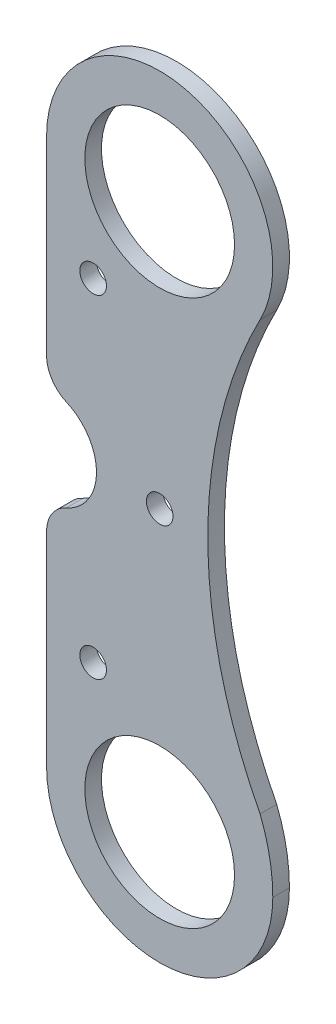
ISO-10303-21;
HEADER;
FILE_DESCRIPTION(('STEP AP214'),'2;1');
FILE_NAME('part.step','',(''),(''),'','','');
FILE_SCHEMA(('AUTOMOTIVE_DESIGN { 1 0 10303 214 1 1 1 1 }'));
ENDSEC;
DATA;
#1=APPLICATION_CONTEXT('core data for automotive mechanical design processes');
#2=APPLICATION_PROTOCOL_DEFINITION('international standard','automotive_design',2000,#1);
#3=PRODUCT_CONTEXT('',#1,'mechanical');
#4=PRODUCT('Part','Part','',(#3));
#5=PRODUCT_RELATED_PRODUCT_CATEGORY('part','',(#4));
#6=PRODUCT_DEFINITION_FORMATION('','',#4);
#7=PRODUCT_DEFINITION_CONTEXT('part definition',#1,'design');
#8=PRODUCT_DEFINITION('design','',#6,#7);
#9=PRODUCT_DEFINITION_SHAPE('','',#8);
#10=(LENGTH_UNIT() NAMED_UNIT(*) SI_UNIT(.MILLI.,.METRE.));
#11=(NAMED_UNIT(*) PLANE_ANGLE_UNIT() SI_UNIT($,.RADIAN.));
#12=(NAMED_UNIT(*) SI_UNIT($,.STERADIAN.) SOLID_ANGLE_UNIT());
#13=UNCERTAINTY_MEASURE_WITH_UNIT(LENGTH_MEASURE(1.E-05),#10,'distance_accuracy_value','');
#14=(GEOMETRIC_REPRESENTATION_CONTEXT(3) GLOBAL_UNCERTAINTY_ASSIGNED_CONTEXT((#13)) GLOBAL_UNIT_ASSIGNED_CONTEXT((#10,
#11,#12)) REPRESENTATION_CONTEXT('',''));
#15=CARTESIAN_POINT('',(0.,0.,0.));
#16=DIRECTION('',(0.,0.,1.));
#17=DIRECTION('',(1.,0.,0.));
#18=AXIS2_PLACEMENT_3D('',#15,#16,#17);
#19=CARTESIAN_POINT('',(0.,0.,3.175));
#20=DIRECTION('',(0.,0.,-1.));
#21=DIRECTION('',(-1.,0.,0.));
#22=AXIS2_PLACEMENT_3D('',#19,#20,#21);
#23=CYLINDRICAL_SURFACE('',#22,14.2875);
#24=CARTESIAN_POINT('',(0.,0.,3.175));
#25=DIRECTION('',(0.,0.,1.));
#26=DIRECTION('',(1.,0.,0.));
#27=AXIS2_PLACEMENT_3D('',#24,#25,#26);
#28=CIRCLE('',#27,14.2875);
#29=CARTESIAN_POINT('',(14.2875,0.,3.175));
#30=VERTEX_POINT('',#29);
#31=EDGE_CURVE('E202',#30,#30,#28,.T.);
#32=ORIENTED_EDGE('',*,*,#31,.T.);
#33=EDGE_LOOP('',(#32));
#34=FACE_BOUND('',#33,.T.);
#35=CARTESIAN_POINT('',(0.,0.,0.));
#36=DIRECTION('',(0.,0.,1.));
#37=DIRECTION('',(1.,0.,0.));
#38=AXIS2_PLACEMENT_3D('',#35,#36,#37);
#39=CIRCLE('',#38,14.2875);
#40=CARTESIAN_POINT('',(14.2875,0.,0.));
#41=VERTEX_POINT('',#40);
#42=EDGE_CURVE('E208',#41,#41,#39,.T.);
#43=ORIENTED_EDGE('',*,*,#42,.F.);
#44=EDGE_LOOP('',(#43));
#45=FACE_BOUND('',#44,.T.);
#46=ADVANCED_FACE('F74',(#34,#45),#23,.F.);
#47=CARTESIAN_POINT('',(0.,-50.8,3.175));
#48=DIRECTION('',(0.,0.,-1.));
#49=DIRECTION('',(-1.,0.,0.));
#50=AXIS2_PLACEMENT_3D('',#47,#48,#49);
#51=CYLINDRICAL_SURFACE('',#50,2.54);
#52=CARTESIAN_POINT('',(0.,-50.8,3.175));
#53=DIRECTION('',(0.,0.,1.));
#54=DIRECTION('',(1.,0.,0.));
#55=AXIS2_PLACEMENT_3D('',#52,#53,#54);
#56=CIRCLE('',#55,2.54);
#57=CARTESIAN_POINT('',(2.54000000000001,-50.8,3.175));
#58=VERTEX_POINT('',#57);
#59=EDGE_CURVE('E213',#58,#58,#56,.T.);
#60=ORIENTED_EDGE('',*,*,#59,.T.);
#61=EDGE_LOOP('',(#60));
#62=FACE_BOUND('',#61,.T.);
#63=CARTESIAN_POINT('',(0.,-50.8,0.));
#64=DIRECTION('',(0.,0.,1.));
#65=DIRECTION('',(1.,0.,0.));
#66=AXIS2_PLACEMENT_3D('',#63,#64,#65);
#67=CIRCLE('',#66,2.54);
#68=CARTESIAN_POINT('',(2.54000000000001,-50.8,0.));
#69=VERTEX_POINT('',#68);
#70=EDGE_CURVE('E209',#69,#69,#67,.T.);
#71=ORIENTED_EDGE('',*,*,#70,.F.);
#72=EDGE_LOOP('',(#71));
#73=FACE_BOUND('',#72,.T.);
#74=ADVANCED_FACE('F263',(#62,#73),#51,.F.);
#75=CARTESIAN_POINT('',(-21.59,12.7,3.175));
#76=DIRECTION('',(1.,0.,0.));
#77=DIRECTION('',(0.,1.,0.));
#78=AXIS2_PLACEMENT_3D('',#75,#76,#77);
#79=PLANE('',#78);
#80=DIRECTION('',(0.,-1.,0.));
#81=VECTOR('',#80,1.);
#82=CARTESIAN_POINT('',(-21.59,12.7,3.175));
#83=LINE('',#82,#81);
#84=CARTESIAN_POINT('',(-21.59,0.,3.175));
#85=VERTEX_POINT('',#84);
#86=CARTESIAN_POINT('',(-21.59,-36.2503221685152,3.175));
#87=VERTEX_POINT('',#86);
#88=EDGE_CURVE('E96',#85,#87,#83,.T.);
#89=ORIENTED_EDGE('',*,*,#88,.F.);
#90=DIRECTION('',(0.,0.,1.));
#91=VECTOR('',#90,1.);
#92=CARTESIAN_POINT('',(-21.59,0.,0.));
#93=LINE('',#92,#91);
#94=CARTESIAN_POINT('',(-21.59,0.,0.));
#95=VERTEX_POINT('',#94);
#96=EDGE_CURVE('E155',#95,#85,#93,.T.);
#97=ORIENTED_EDGE('',*,*,#96,.F.);
#98=DIRECTION('',(0.,-1.,0.));
#99=VECTOR('',#98,1.);
#100=CARTESIAN_POINT('',(-21.59,12.7,0.));
#101=LINE('',#100,#99);
#102=CARTESIAN_POINT('',(-21.59,-36.2503221685152,0.));
#103=VERTEX_POINT('',#102);
#104=EDGE_CURVE('E218',#95,#103,#101,.T.);
#105=ORIENTED_EDGE('',*,*,#104,.T.);
#106=DIRECTION('',(0.,0.,1.));
#107=VECTOR('',#106,1.);
#108=CARTESIAN_POINT('',(-21.59,-36.2503221685152,3.175));
#109=LINE('',#108,#107);
#110=EDGE_CURVE('E229',#103,#87,#109,.T.);
#111=ORIENTED_EDGE('',*,*,#110,.T.);
#112=EDGE_LOOP('',(#89,#97,#105,#111));
#113=FACE_BOUND('',#112,.T.);
#114=ADVANCED_FACE('F283',(#113),#79,.F.);
#115=CARTESIAN_POINT('',(-21.59,-65.3496778314848,0.));
#116=VERTEX_POINT('',#115);
#117=CARTESIAN_POINT('',(-21.59,-104.23906,0.));
#118=VERTEX_POINT('',#117);
#119=EDGE_CURVE('E207',#116,#118,#101,.T.);
#120=ORIENTED_EDGE('',*,*,#119,.T.);
#121=DIRECTION('',(0.,0.,1.));
#122=VECTOR('',#121,1.);
#123=CARTESIAN_POINT('',(-21.59,-104.23906,0.));
#124=LINE('',#123,#122);
#125=CARTESIAN_POINT('',(-21.59,-104.23906,3.175));
#126=VERTEX_POINT('',#125);
#127=EDGE_CURVE('E156',#118,#126,#124,.T.);
#128=ORIENTED_EDGE('',*,*,#127,.T.);
#129=CARTESIAN_POINT('',(-21.59,-65.3496778314848,3.175));
#130=VERTEX_POINT('',#129);
#131=EDGE_CURVE('E217',#130,#126,#83,.T.);
#132=ORIENTED_EDGE('',*,*,#131,.F.);
#133=DIRECTION('',(0.,0.,1.));
#134=VECTOR('',#133,1.);
#135=CARTESIAN_POINT('',(-21.59,-65.3496778314848,0.));
#136=LINE('',#135,#134);
#137=EDGE_CURVE('E13',#130,#116,#136,.F.);
#138=ORIENTED_EDGE('',*,*,#137,.T.);
#139=EDGE_LOOP('',(#120,#128,#132,#138));
#140=FACE_BOUND('',#139,.T.);
#141=ADVANCED_FACE('F246',(#140),#79,.F.);
#142=CARTESIAN_POINT('',(8.89000000000001,12.7,0.));
#143=DIRECTION('',(0.,0.,-1.));
#144=DIRECTION('',(-1.,0.,0.));
#145=AXIS2_PLACEMENT_3D('',#142,#143,#144);
#146=PLANE('',#145);
#147=CARTESIAN_POINT('',(-12.7,-19.05,0.));
#148=DIRECTION('',(0.,0.,-1.));
#149=DIRECTION('',(-1.,0.,0.));
#150=AXIS2_PLACEMENT_3D('',#147,#148,#149);
#151=CIRCLE('',#150,2.54);
#152=CARTESIAN_POINT('',(-15.24,-19.05,0.));
#153=VERTEX_POINT('',#152);
#154=EDGE_CURVE('E391',#153,#153,#151,.T.);
#155=ORIENTED_EDGE('',*,*,#154,.F.);
#156=EDGE_LOOP('',(#155));
#157=FACE_BOUND('',#156,.T.);
#158=CARTESIAN_POINT('',(-12.7,-82.55,0.));
#159=DIRECTION('',(0.,0.,-1.));
#160=DIRECTION('',(-1.,0.,0.));
#161=AXIS2_PLACEMENT_3D('',#158,#159,#160);
#162=CIRCLE('',#161,2.54);
#163=CARTESIAN_POINT('',(-15.24,-82.55,0.));
#164=VERTEX_POINT('',#163);
#165=EDGE_CURVE('E396',#164,#164,#162,.T.);
#166=ORIENTED_EDGE('',*,*,#165,.F.);
#167=EDGE_LOOP('',(#166));
#168=FACE_BOUND('',#167,.T.);
#169=CARTESIAN_POINT('',(-12.2374713385837,-104.23906,0.));
#170=DIRECTION('',(0.,0.,-1.));
#171=DIRECTION('',(-1.,0.,0.));
#172=AXIS2_PLACEMENT_3D('',#169,#170,#171);
#173=CIRCLE('',#172,33.8274713385837);
#174=CARTESIAN_POINT('',(19.1590830035103,-91.6472296085661,0.));
#175=VERTEX_POINT('',#174);
#176=CARTESIAN_POINT('',(21.59,-104.23906,0.));
#177=VERTEX_POINT('',#176);
#178=EDGE_CURVE('E147',#175,#177,#173,.T.);
#179=ORIENTED_EDGE('',*,*,#178,.T.);
#180=CARTESIAN_POINT('',(0.,-104.23906,0.));
#181=DIRECTION('',(0.,0.,1.));
#182=DIRECTION('',(1.,0.,0.));
#183=AXIS2_PLACEMENT_3D('',#180,#181,#182);
#184=CIRCLE('',#183,21.59);
#185=EDGE_CURVE('E164',#118,#177,#184,.T.);
#186=ORIENTED_EDGE('',*,*,#185,.F.);
#187=ORIENTED_EDGE('',*,*,#119,.F.);
#188=CARTESIAN_POINT('',(-15.24,-65.3496778314848,0.));
#189=DIRECTION('',(0.,0.,-1.));
#190=DIRECTION('',(-1.,0.,0.));
#191=AXIS2_PLACEMENT_3D('',#188,#189,#190);
#192=CIRCLE('',#191,6.35);
#193=CARTESIAN_POINT('',(-17.78,-59.5298066988909,0.));
#194=VERTEX_POINT('',#193);
#195=EDGE_CURVE('E224',#116,#194,#192,.T.);
#196=ORIENTED_EDGE('',*,*,#195,.T.);
#197=CARTESIAN_POINT('',(-21.59,-50.8,0.));
#198=DIRECTION('',(0.,0.,1.));
#199=DIRECTION('',(1.,0.,0.));
#200=AXIS2_PLACEMENT_3D('',#197,#198,#199);
#201=CIRCLE('',#200,9.525);
#202=CARTESIAN_POINT('',(-17.78,-42.0701933011091,0.));
#203=VERTEX_POINT('',#202);
#204=EDGE_CURVE('E185',#194,#203,#201,.T.);
#205=ORIENTED_EDGE('',*,*,#204,.T.);
#206=CARTESIAN_POINT('',(-15.24,-36.2503221685152,0.));
#207=DIRECTION('',(0.,0.,-1.));
#208=DIRECTION('',(-1.,0.,0.));
#209=AXIS2_PLACEMENT_3D('',#206,#207,#208);
#210=CIRCLE('',#209,6.35);
#211=EDGE_CURVE('E226',#203,#103,#210,.T.);
#212=ORIENTED_EDGE('',*,*,#211,.T.);
#213=ORIENTED_EDGE('',*,*,#104,.F.);
#214=CARTESIAN_POINT('',(0.,0.,0.));
#215=DIRECTION('',(0.,0.,-1.));
#216=DIRECTION('',(-1.,0.,0.));
#217=AXIS2_PLACEMENT_3D('',#214,#215,#216);
#218=CIRCLE('',#217,21.59);
#219=CARTESIAN_POINT('',(19.1590830035103,-9.9527703914339,0.));
#220=VERTEX_POINT('',#219);
#221=EDGE_CURVE('E195',#95,#220,#218,.T.);
#222=ORIENTED_EDGE('',*,*,#221,.T.);
#223=CARTESIAN_POINT('',(97.79,-50.8,0.));
#224=DIRECTION('',(0.,0.,-1.));
#225=DIRECTION('',(-1.,0.,0.));
#226=AXIS2_PLACEMENT_3D('',#223,#224,#225);
#227=CIRCLE('',#226,88.6076592310381);
#228=EDGE_CURVE('E167',#175,#220,#227,.T.);
#229=ORIENTED_EDGE('',*,*,#228,.F.);
#230=EDGE_LOOP('',(#179,#186,#187,#196,#205,#212,#213,#222,#229));
#231=FACE_BOUND('',#230,.T.);
#232=CARTESIAN_POINT('',(0.,-104.23906,0.));
#233=DIRECTION('',(0.,0.,1.));
#234=DIRECTION('',(1.,0.,0.));
#235=AXIS2_PLACEMENT_3D('',#232,#233,#234);
#236=CIRCLE('',#235,14.2875);
#237=CARTESIAN_POINT('',(14.2875,-104.23906,0.));
#238=VERTEX_POINT('',#237);
#239=EDGE_CURVE('E176',#238,#238,#236,.T.);
#240=ORIENTED_EDGE('',*,*,#239,.T.);
#241=EDGE_LOOP('',(#240));
#242=FACE_BOUND('',#241,.T.);
#243=ORIENTED_EDGE('',*,*,#70,.T.);
#244=EDGE_LOOP('',(#243));
#245=FACE_BOUND('',#244,.T.);
#246=ORIENTED_EDGE('',*,*,#42,.T.);
#247=EDGE_LOOP('',(#246));
#248=FACE_BOUND('',#247,.T.);
#249=ADVANCED_FACE('F161',(#157,#168,#231,#242,#245,#248),#146,.T.);
#250=CARTESIAN_POINT('',(8.89000000000001,12.7,3.175));
#251=DIRECTION('',(0.,0.,-1.));
#252=DIRECTION('',(-1.,0.,0.));
#253=AXIS2_PLACEMENT_3D('',#250,#251,#252);
#254=PLANE('',#253);
#255=CARTESIAN_POINT('',(-12.7,-19.05,3.175));
#256=DIRECTION('',(0.,0.,-1.));
#257=DIRECTION('',(-1.,0.,0.));
#258=AXIS2_PLACEMENT_3D('',#255,#256,#257);
#259=CIRCLE('',#258,2.54);
#260=CARTESIAN_POINT('',(-15.24,-19.05,3.175));
#261=VERTEX_POINT('',#260);
#262=EDGE_CURVE('E248',#261,#261,#259,.T.);
#263=ORIENTED_EDGE('',*,*,#262,.T.);
#264=EDGE_LOOP('',(#263));
#265=FACE_BOUND('',#264,.T.);
#266=CARTESIAN_POINT('',(-12.7,-82.55,3.175));
#267=DIRECTION('',(0.,0.,-1.));
#268=DIRECTION('',(-1.,0.,0.));
#269=AXIS2_PLACEMENT_3D('',#266,#267,#268);
#270=CIRCLE('',#269,2.54);
#271=CARTESIAN_POINT('',(-15.24,-82.55,3.175));
#272=VERTEX_POINT('',#271);
#273=EDGE_CURVE('E392',#272,#272,#270,.T.);
#274=ORIENTED_EDGE('',*,*,#273,.T.);
#275=EDGE_LOOP('',(#274));
#276=FACE_BOUND('',#275,.T.);
#277=CARTESIAN_POINT('',(0.,-104.23906,3.175));
#278=DIRECTION('',(0.,0.,1.));
#279=DIRECTION('',(1.,0.,0.));
#280=AXIS2_PLACEMENT_3D('',#277,#278,#279);
#281=CIRCLE('',#280,14.2875);
#282=CARTESIAN_POINT('',(14.2875,-104.23906,3.175));
#283=VERTEX_POINT('',#282);
#284=EDGE_CURVE('E168',#283,#283,#281,.T.);
#285=ORIENTED_EDGE('',*,*,#284,.F.);
#286=EDGE_LOOP('',(#285));
#287=FACE_BOUND('',#286,.T.);
#288=CARTESIAN_POINT('',(0.,-104.23906,3.175));
#289=DIRECTION('',(0.,0.,1.));
#290=DIRECTION('',(1.,0.,0.));
#291=AXIS2_PLACEMENT_3D('',#288,#289,#290);
#292=CIRCLE('',#291,21.59);
#293=CARTESIAN_POINT('',(21.59,-104.23906,3.175));
#294=VERTEX_POINT('',#293);
#295=EDGE_CURVE('E173',#126,#294,#292,.T.);
#296=ORIENTED_EDGE('',*,*,#295,.T.);
#297=CARTESIAN_POINT('',(-12.2374713385837,-104.23906,3.175));
#298=DIRECTION('',(0.,0.,-1.));
#299=DIRECTION('',(-1.,0.,0.));
#300=AXIS2_PLACEMENT_3D('',#297,#298,#299);
#301=CIRCLE('',#300,33.8274713385837);
#302=CARTESIAN_POINT('',(19.1590830035103,-91.6472296085661,3.175));
#303=VERTEX_POINT('',#302);
#304=EDGE_CURVE('E150',#303,#294,#301,.T.);
#305=ORIENTED_EDGE('',*,*,#304,.F.);
#306=CARTESIAN_POINT('',(97.79,-50.8,3.175));
#307=DIRECTION('',(0.,0.,-1.));
#308=DIRECTION('',(-1.,0.,0.));
#309=AXIS2_PLACEMENT_3D('',#306,#307,#308);
#310=CIRCLE('',#309,88.6076592310381);
#311=CARTESIAN_POINT('',(19.1590830035103,-9.9527703914339,3.175));
#312=VERTEX_POINT('',#311);
#313=EDGE_CURVE('E190',#303,#312,#310,.T.);
#314=ORIENTED_EDGE('',*,*,#313,.T.);
#315=CARTESIAN_POINT('',(0.,0.,3.175));
#316=DIRECTION('',(0.,0.,-1.));
#317=DIRECTION('',(-1.,0.,0.));
#318=AXIS2_PLACEMENT_3D('',#315,#316,#317);
#319=CIRCLE('',#318,21.59);
#320=EDGE_CURVE('E194',#85,#312,#319,.T.);
#321=ORIENTED_EDGE('',*,*,#320,.F.);
#322=ORIENTED_EDGE('',*,*,#88,.T.);
#323=CARTESIAN_POINT('',(-15.24,-36.2503221685152,3.175));
#324=DIRECTION('',(0.,0.,-1.));
#325=DIRECTION('',(-1.,0.,0.));
#326=AXIS2_PLACEMENT_3D('',#323,#324,#325);
#327=CIRCLE('',#326,6.35);
#328=CARTESIAN_POINT('',(-17.78,-42.0701933011091,3.175));
#329=VERTEX_POINT('',#328);
#330=EDGE_CURVE('E82',#87,#329,#327,.F.);
#331=ORIENTED_EDGE('',*,*,#330,.T.);
#332=CARTESIAN_POINT('',(-21.59,-50.8,3.175));
#333=DIRECTION('',(0.,0.,1.));
#334=DIRECTION('',(1.,0.,0.));
#335=AXIS2_PLACEMENT_3D('',#332,#333,#334);
#336=CIRCLE('',#335,9.525);
#337=CARTESIAN_POINT('',(-17.78,-59.5298066988909,3.175));
#338=VERTEX_POINT('',#337);
#339=EDGE_CURVE('E184',#338,#329,#336,.T.);
#340=ORIENTED_EDGE('',*,*,#339,.F.);
#341=CARTESIAN_POINT('',(-15.24,-65.3496778314848,3.175));
#342=DIRECTION('',(0.,0.,-1.));
#343=DIRECTION('',(-1.,0.,0.));
#344=AXIS2_PLACEMENT_3D('',#341,#342,#343);
#345=CIRCLE('',#344,6.35);
#346=EDGE_CURVE('E89',#338,#130,#345,.F.);
#347=ORIENTED_EDGE('',*,*,#346,.T.);
#348=ORIENTED_EDGE('',*,*,#131,.T.);
#349=EDGE_LOOP('',(#296,#305,#314,#321,#322,#331,#340,#347,#348));
#350=FACE_BOUND('',#349,.T.);
#351=ORIENTED_EDGE('',*,*,#59,.F.);
#352=EDGE_LOOP('',(#351));
#353=FACE_BOUND('',#352,.T.);
#354=ORIENTED_EDGE('',*,*,#31,.F.);
#355=EDGE_LOOP('',(#354));
#356=FACE_BOUND('',#355,.T.);
#357=ADVANCED_FACE('F232',(#265,#276,#287,#350,#353,#356),#254,.F.);
#358=CARTESIAN_POINT('',(0.,0.,3.175));
#359=DIRECTION('',(0.,0.,-1.));
#360=DIRECTION('',(-1.,0.,0.));
#361=AXIS2_PLACEMENT_3D('',#358,#359,#360);
#362=CYLINDRICAL_SURFACE('',#361,21.59);
#363=ORIENTED_EDGE('',*,*,#221,.F.);
#364=ORIENTED_EDGE('',*,*,#96,.T.);
#365=ORIENTED_EDGE('',*,*,#320,.T.);
#366=DIRECTION('',(0.,0.,-1.));
#367=VECTOR('',#366,1.);
#368=CARTESIAN_POINT('',(19.1590830035103,-9.9527703914339,3.175));
#369=LINE('',#368,#367);
#370=EDGE_CURVE('E254',#312,#220,#369,.T.);
#371=ORIENTED_EDGE('',*,*,#370,.T.);
#372=EDGE_LOOP('',(#363,#364,#365,#371));
#373=FACE_BOUND('',#372,.T.);
#374=ADVANCED_FACE('F267',(#373),#362,.T.);
#375=CARTESIAN_POINT('',(97.79,-50.8,3.175));
#376=DIRECTION('',(0.,0.,-1.));
#377=DIRECTION('',(-1.,0.,0.));
#378=AXIS2_PLACEMENT_3D('',#375,#376,#377);
#379=CYLINDRICAL_SURFACE('',#378,88.6076592310381);
#380=ORIENTED_EDGE('',*,*,#228,.T.);
#381=ORIENTED_EDGE('',*,*,#370,.F.);
#382=ORIENTED_EDGE('',*,*,#313,.F.);
#383=DIRECTION('',(0.,0.,-1.));
#384=VECTOR('',#383,1.);
#385=CARTESIAN_POINT('',(19.1590830035103,-91.6472296085661,3.175));
#386=LINE('',#385,#384);
#387=EDGE_CURVE('E253',#303,#175,#386,.T.);
#388=ORIENTED_EDGE('',*,*,#387,.T.);
#389=EDGE_LOOP('',(#380,#381,#382,#388));
#390=FACE_BOUND('',#389,.T.);
#391=ADVANCED_FACE('F252',(#390),#379,.F.);
#392=CARTESIAN_POINT('',(-21.59,-50.8,3.175));
#393=DIRECTION('',(0.,0.,-1.));
#394=DIRECTION('',(-1.,0.,0.));
#395=AXIS2_PLACEMENT_3D('',#392,#393,#394);
#396=CYLINDRICAL_SURFACE('',#395,9.525);
#397=ORIENTED_EDGE('',*,*,#339,.T.);
#398=DIRECTION('',(0.,0.,-1.));
#399=VECTOR('',#398,1.);
#400=CARTESIAN_POINT('',(-17.78,-42.0701933011091,3.175));
#401=LINE('',#400,#399);
#402=EDGE_CURVE('E221',#329,#203,#401,.T.);
#403=ORIENTED_EDGE('',*,*,#402,.T.);
#404=ORIENTED_EDGE('',*,*,#204,.F.);
#405=DIRECTION('',(0.,0.,-1.));
#406=VECTOR('',#405,1.);
#407=CARTESIAN_POINT('',(-17.78,-59.5298066988909,3.175));
#408=LINE('',#407,#406);
#409=EDGE_CURVE('E216',#194,#338,#408,.F.);
#410=ORIENTED_EDGE('',*,*,#409,.T.);
#411=EDGE_LOOP('',(#397,#403,#404,#410));
#412=FACE_BOUND('',#411,.T.);
#413=ADVANCED_FACE('F238',(#412),#396,.F.);
#414=CARTESIAN_POINT('',(-15.24,-36.2503221685152,3.175));
#415=DIRECTION('',(0.,0.,-1.));
#416=DIRECTION('',(-1.,0.,0.));
#417=AXIS2_PLACEMENT_3D('',#414,#415,#416);
#418=CYLINDRICAL_SURFACE('',#417,6.35);
#419=ORIENTED_EDGE('',*,*,#330,.F.);
#420=ORIENTED_EDGE('',*,*,#110,.F.);
#421=ORIENTED_EDGE('',*,*,#211,.F.);
#422=ORIENTED_EDGE('',*,*,#402,.F.);
#423=EDGE_LOOP('',(#419,#420,#421,#422));
#424=FACE_BOUND('',#423,.T.);
#425=ADVANCED_FACE('F241',(#424),#418,.T.);
#426=CARTESIAN_POINT('',(-15.24,-65.3496778314848,3.175));
#427=DIRECTION('',(0.,0.,-1.));
#428=DIRECTION('',(-1.,0.,0.));
#429=AXIS2_PLACEMENT_3D('',#426,#427,#428);
#430=CYLINDRICAL_SURFACE('',#429,6.35);
#431=ORIENTED_EDGE('',*,*,#346,.F.);
#432=ORIENTED_EDGE('',*,*,#409,.F.);
#433=ORIENTED_EDGE('',*,*,#195,.F.);
#434=ORIENTED_EDGE('',*,*,#137,.F.);
#435=EDGE_LOOP('',(#431,#432,#433,#434));
#436=FACE_BOUND('',#435,.T.);
#437=ADVANCED_FACE('F76',(#436),#430,.T.);
#438=CARTESIAN_POINT('',(0.,-104.23906,0.));
#439=DIRECTION('',(0.,0.,1.));
#440=DIRECTION('',(1.,0.,0.));
#441=AXIS2_PLACEMENT_3D('',#438,#439,#440);
#442=CYLINDRICAL_SURFACE('',#441,21.59);
#443=ORIENTED_EDGE('',*,*,#295,.F.);
#444=ORIENTED_EDGE('',*,*,#127,.F.);
#445=ORIENTED_EDGE('',*,*,#185,.T.);
#446=DIRECTION('',(0.,0.,1.));
#447=VECTOR('',#446,1.);
#448=CARTESIAN_POINT('',(21.59,-104.23906,0.));
#449=LINE('',#448,#447);
#450=EDGE_CURVE('E144',#177,#294,#449,.T.);
#451=ORIENTED_EDGE('',*,*,#450,.T.);
#452=EDGE_LOOP('',(#443,#444,#445,#451));
#453=FACE_BOUND('',#452,.T.);
#454=ADVANCED_FACE('F171',(#453),#442,.T.);
#455=CARTESIAN_POINT('',(0.,-104.23906,0.));
#456=DIRECTION('',(0.,0.,1.));
#457=DIRECTION('',(1.,0.,0.));
#458=AXIS2_PLACEMENT_3D('',#455,#456,#457);
#459=CYLINDRICAL_SURFACE('',#458,14.2875);
#460=ORIENTED_EDGE('',*,*,#239,.F.);
#461=EDGE_LOOP('',(#460));
#462=FACE_BOUND('',#461,.T.);
#463=ORIENTED_EDGE('',*,*,#284,.T.);
#464=EDGE_LOOP('',(#463));
#465=FACE_BOUND('',#464,.T.);
#466=ADVANCED_FACE('F325',(#462,#465),#459,.F.);
#467=CARTESIAN_POINT('',(-12.2374713385837,-104.23906,0.));
#468=DIRECTION('',(0.,0.,1.));
#469=DIRECTION('',(1.,0.,0.));
#470=AXIS2_PLACEMENT_3D('',#467,#468,#469);
#471=CYLINDRICAL_SURFACE('',#470,33.8274713385837);
#472=ORIENTED_EDGE('',*,*,#304,.T.);
#473=ORIENTED_EDGE('',*,*,#450,.F.);
#474=ORIENTED_EDGE('',*,*,#178,.F.);
#475=ORIENTED_EDGE('',*,*,#387,.F.);
#476=EDGE_LOOP('',(#472,#473,#474,#475));
#477=FACE_BOUND('',#476,.T.);
#478=ADVANCED_FACE('F146',(#477),#471,.T.);
#479=CARTESIAN_POINT('',(-12.7,-82.55,3.175));
#480=DIRECTION('',(0.,0.,-1.));
#481=DIRECTION('',(-1.,0.,0.));
#482=AXIS2_PLACEMENT_3D('',#479,#480,#481);
#483=CYLINDRICAL_SURFACE('',#482,2.54);
#484=ORIENTED_EDGE('',*,*,#273,.F.);
#485=EDGE_LOOP('',(#484));
#486=FACE_BOUND('',#485,.T.);
#487=ORIENTED_EDGE('',*,*,#165,.T.);
#488=EDGE_LOOP('',(#487));
#489=FACE_BOUND('',#488,.T.);
#490=ADVANCED_FACE('F355',(#486,#489),#483,.F.);
#491=CARTESIAN_POINT('',(-12.7,-19.05,3.175));
#492=DIRECTION('',(0.,0.,-1.));
#493=DIRECTION('',(-1.,0.,0.));
#494=AXIS2_PLACEMENT_3D('',#491,#492,#493);
#495=CYLINDRICAL_SURFACE('',#494,2.54);
#496=ORIENTED_EDGE('',*,*,#262,.F.);
#497=EDGE_LOOP('',(#496));
#498=FACE_BOUND('',#497,.T.);
#499=ORIENTED_EDGE('',*,*,#154,.T.);
#500=EDGE_LOOP('',(#499));
#501=FACE_BOUND('',#500,.T.);
#502=ADVANCED_FACE('F373',(#498,#501),#495,.F.);
#503=CLOSED_SHELL('',(#46,#74,#114,#141,#249,#357,#374,#391,#413,#425,#437,#454,#466,#478,#490,#502));
#504=MANIFOLD_SOLID_BREP('B2',#503);
#505=ADVANCED_BREP_SHAPE_REPRESENTATION('',(#18,#504),#14);
#506=SHAPE_DEFINITION_REPRESENTATION(#9,#505);
ENDSEC;
END-ISO-10303-21;
